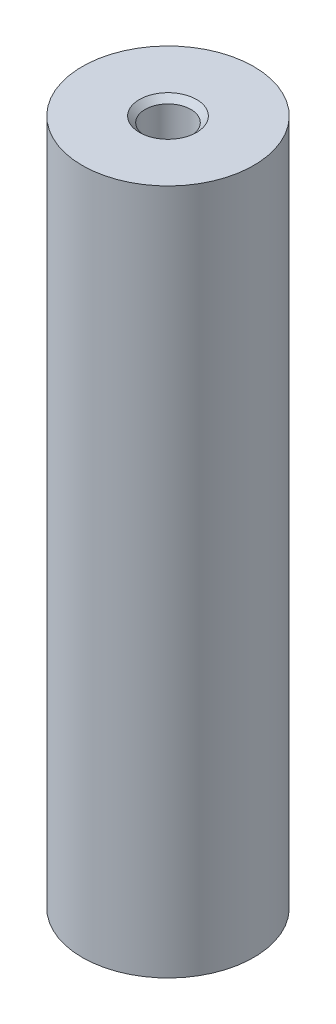
ISO-10303-21;
HEADER;
FILE_DESCRIPTION(('STEP AP214'),'2;1');
FILE_NAME('part.step','',(''),(''),'','','');
FILE_SCHEMA(('AUTOMOTIVE_DESIGN { 1 0 10303 214 1 1 1 1 }'));
ENDSEC;
DATA;
#1=APPLICATION_CONTEXT('core data for automotive mechanical design processes');
#2=APPLICATION_PROTOCOL_DEFINITION('international standard','automotive_design',2000,#1);
#3=PRODUCT_CONTEXT('',#1,'mechanical');
#4=PRODUCT('Part','Part','',(#3));
#5=PRODUCT_RELATED_PRODUCT_CATEGORY('part','',(#4));
#6=PRODUCT_DEFINITION_FORMATION('','',#4);
#7=PRODUCT_DEFINITION_CONTEXT('part definition',#1,'design');
#8=PRODUCT_DEFINITION('design','',#6,#7);
#9=PRODUCT_DEFINITION_SHAPE('','',#8);
#10=(LENGTH_UNIT() NAMED_UNIT(*) SI_UNIT(.MILLI.,.METRE.));
#11=(NAMED_UNIT(*) PLANE_ANGLE_UNIT() SI_UNIT($,.RADIAN.));
#12=(NAMED_UNIT(*) SI_UNIT($,.STERADIAN.) SOLID_ANGLE_UNIT());
#13=UNCERTAINTY_MEASURE_WITH_UNIT(LENGTH_MEASURE(1.E-05),#10,'distance_accuracy_value','');
#14=(GEOMETRIC_REPRESENTATION_CONTEXT(3) GLOBAL_UNCERTAINTY_ASSIGNED_CONTEXT((#13)) GLOBAL_UNIT_ASSIGNED_CONTEXT((#10,
#11,#12)) REPRESENTATION_CONTEXT('',''));
#15=CARTESIAN_POINT('',(0.,0.,0.));
#16=DIRECTION('',(0.,0.,1.));
#17=DIRECTION('',(1.,0.,0.));
#18=AXIS2_PLACEMENT_3D('',#15,#16,#17);
#19=CARTESIAN_POINT('',(0.,60.,0.));
#20=DIRECTION('',(0.,-1.,0.));
#21=DIRECTION('',(0.,0.,-1.));
#22=AXIS2_PLACEMENT_3D('',#19,#20,#21);
#23=CYLINDRICAL_SURFACE('',#22,7.5);
#24=CARTESIAN_POINT('',(0.,60.,0.));
#25=DIRECTION('',(0.,1.,0.));
#26=DIRECTION('',(0.,0.,1.));
#27=AXIS2_PLACEMENT_3D('',#24,#25,#26);
#28=CIRCLE('',#27,7.5);
#29=CARTESIAN_POINT('',(0.,60.,7.5));
#30=VERTEX_POINT('',#29);
#31=EDGE_CURVE('E62',#30,#30,#28,.T.);
#32=ORIENTED_EDGE('',*,*,#31,.F.);
#33=EDGE_LOOP('',(#32));
#34=FACE_BOUND('',#33,.T.);
#35=CARTESIAN_POINT('',(0.,0.,0.));
#36=DIRECTION('',(0.,1.,0.));
#37=DIRECTION('',(0.,0.,1.));
#38=AXIS2_PLACEMENT_3D('',#35,#36,#37);
#39=CIRCLE('',#38,7.5);
#40=CARTESIAN_POINT('',(0.,0.,7.5));
#41=VERTEX_POINT('',#40);
#42=EDGE_CURVE('E63',#41,#41,#39,.T.);
#43=ORIENTED_EDGE('',*,*,#42,.T.);
#44=EDGE_LOOP('',(#43));
#45=FACE_BOUND('',#44,.T.);
#46=ADVANCED_FACE('F41',(#34,#45),#23,.T.);
#47=CARTESIAN_POINT('',(0.,60.,0.));
#48=DIRECTION('',(0.,1.,0.));
#49=DIRECTION('',(0.,0.,1.));
#50=AXIS2_PLACEMENT_3D('',#47,#48,#49);
#51=PLANE('',#50);
#52=CARTESIAN_POINT('',(0.,60.,0.));
#53=DIRECTION('',(0.,1.,0.));
#54=DIRECTION('',(0.,0.,1.));
#55=AXIS2_PLACEMENT_3D('',#52,#53,#54);
#56=CIRCLE('',#55,2.5);
#57=CARTESIAN_POINT('',(0.,60.,2.5));
#58=VERTEX_POINT('',#57);
#59=EDGE_CURVE('E53',#58,#58,#56,.F.);
#60=ORIENTED_EDGE('',*,*,#59,.T.);
#61=EDGE_LOOP('',(#60));
#62=FACE_BOUND('',#61,.T.);
#63=ORIENTED_EDGE('',*,*,#31,.T.);
#64=EDGE_LOOP('',(#63));
#65=FACE_BOUND('',#64,.T.);
#66=ADVANCED_FACE('F92',(#62,#65),#51,.T.);
#67=CARTESIAN_POINT('',(0.,0.,0.));
#68=DIRECTION('',(0.,1.,0.));
#69=DIRECTION('',(0.,0.,1.));
#70=AXIS2_PLACEMENT_3D('',#67,#68,#69);
#71=PLANE('',#70);
#72=CARTESIAN_POINT('',(0.,0.,0.));
#73=DIRECTION('',(0.,1.,0.));
#74=DIRECTION('',(0.,0.,1.));
#75=AXIS2_PLACEMENT_3D('',#72,#73,#74);
#76=CIRCLE('',#75,2.5);
#77=CARTESIAN_POINT('',(0.,0.,2.5));
#78=VERTEX_POINT('',#77);
#79=EDGE_CURVE('E10',#78,#78,#76,.T.);
#80=ORIENTED_EDGE('',*,*,#79,.T.);
#81=EDGE_LOOP('',(#80));
#82=FACE_BOUND('',#81,.T.);
#83=ORIENTED_EDGE('',*,*,#42,.F.);
#84=EDGE_LOOP('',(#83));
#85=FACE_BOUND('',#84,.T.);
#86=ADVANCED_FACE('F99',(#82,#85),#71,.F.);
#87=CARTESIAN_POINT('',(0.,55.,0.));
#88=DIRECTION('',(0.,1.,0.));
#89=DIRECTION('',(0.,0.,1.));
#90=AXIS2_PLACEMENT_3D('',#87,#88,#89);
#91=CYLINDRICAL_SURFACE('',#90,2.);
#92=CARTESIAN_POINT('',(0.,59.5,0.));
#93=DIRECTION('',(0.,1.,0.));
#94=DIRECTION('',(0.,0.,1.));
#95=AXIS2_PLACEMENT_3D('',#92,#93,#94);
#96=CIRCLE('',#95,2.);
#97=CARTESIAN_POINT('',(0.,59.5,2.));
#98=VERTEX_POINT('',#97);
#99=EDGE_CURVE('E57',#98,#98,#96,.T.);
#100=ORIENTED_EDGE('',*,*,#99,.T.);
#101=EDGE_LOOP('',(#100));
#102=FACE_BOUND('',#101,.T.);
#103=CARTESIAN_POINT('',(0.,55.,0.));
#104=DIRECTION('',(0.,1.,0.));
#105=DIRECTION('',(0.,0.,1.));
#106=AXIS2_PLACEMENT_3D('',#103,#104,#105);
#107=CIRCLE('',#106,2.);
#108=CARTESIAN_POINT('',(0.,55.,2.));
#109=VERTEX_POINT('',#108);
#110=EDGE_CURVE('E66',#109,#109,#107,.T.);
#111=ORIENTED_EDGE('',*,*,#110,.F.);
#112=EDGE_LOOP('',(#111));
#113=FACE_BOUND('',#112,.T.);
#114=ADVANCED_FACE('F110',(#102,#113),#91,.F.);
#115=CARTESIAN_POINT('',(0.,55.,0.));
#116=DIRECTION('',(0.,1.,0.));
#117=DIRECTION('',(0.,0.,1.));
#118=AXIS2_PLACEMENT_3D('',#115,#116,#117);
#119=PLANE('',#118);
#120=ORIENTED_EDGE('',*,*,#110,.T.);
#121=EDGE_LOOP('',(#120));
#122=FACE_BOUND('',#121,.T.);
#123=ADVANCED_FACE('F88',(#122),#119,.T.);
#124=CARTESIAN_POINT('',(0.,59.5,0.));
#125=DIRECTION('',(0.,1.,0.));
#126=DIRECTION('',(0.,0.,1.));
#127=AXIS2_PLACEMENT_3D('',#124,#125,#126);
#128=CONICAL_SURFACE('',#127,2.,0.78539816339745);
#129=ORIENTED_EDGE('',*,*,#59,.F.);
#130=EDGE_LOOP('',(#129));
#131=FACE_BOUND('',#130,.T.);
#132=ORIENTED_EDGE('',*,*,#99,.F.);
#133=EDGE_LOOP('',(#132));
#134=FACE_BOUND('',#133,.T.);
#135=ADVANCED_FACE('F79',(#131,#134),#128,.F.);
#136=CARTESIAN_POINT('',(0.,5.,0.));
#137=DIRECTION('',(0.,-1.,0.));
#138=DIRECTION('',(0.,0.,-1.));
#139=AXIS2_PLACEMENT_3D('',#136,#137,#138);
#140=CYLINDRICAL_SURFACE('',#139,2.);
#141=CARTESIAN_POINT('',(0.,0.499999999999995,0.));
#142=DIRECTION('',(0.,1.,0.));
#143=DIRECTION('',(0.,0.,1.));
#144=AXIS2_PLACEMENT_3D('',#141,#142,#143);
#145=CIRCLE('',#144,2.);
#146=CARTESIAN_POINT('',(0.,0.499999999999995,2.));
#147=VERTEX_POINT('',#146);
#148=EDGE_CURVE('E49',#147,#147,#145,.F.);
#149=ORIENTED_EDGE('',*,*,#148,.T.);
#150=EDGE_LOOP('',(#149));
#151=FACE_BOUND('',#150,.T.);
#152=CARTESIAN_POINT('',(0.,5.,0.));
#153=DIRECTION('',(0.,-1.,0.));
#154=DIRECTION('',(0.,0.,-1.));
#155=AXIS2_PLACEMENT_3D('',#152,#153,#154);
#156=CIRCLE('',#155,2.);
#157=CARTESIAN_POINT('',(0.,5.,-2.));
#158=VERTEX_POINT('',#157);
#159=EDGE_CURVE('E71',#158,#158,#156,.T.);
#160=ORIENTED_EDGE('',*,*,#159,.F.);
#161=EDGE_LOOP('',(#160));
#162=FACE_BOUND('',#161,.T.);
#163=ADVANCED_FACE('F77',(#151,#162),#140,.F.);
#164=CARTESIAN_POINT('',(0.,5.,0.));
#165=DIRECTION('',(0.,-1.,0.));
#166=DIRECTION('',(0.,0.,-1.));
#167=AXIS2_PLACEMENT_3D('',#164,#165,#166);
#168=PLANE('',#167);
#169=ORIENTED_EDGE('',*,*,#159,.T.);
#170=EDGE_LOOP('',(#169));
#171=FACE_BOUND('',#170,.T.);
#172=ADVANCED_FACE('F75',(#171),#168,.T.);
#173=CARTESIAN_POINT('',(0.,0.499999999999995,0.));
#174=DIRECTION('',(0.,-1.,0.));
#175=DIRECTION('',(0.,0.,-1.));
#176=AXIS2_PLACEMENT_3D('',#173,#174,#175);
#177=CONICAL_SURFACE('',#176,2.,0.785398163397448);
#178=ORIENTED_EDGE('',*,*,#79,.F.);
#179=EDGE_LOOP('',(#178));
#180=FACE_BOUND('',#179,.T.);
#181=ORIENTED_EDGE('',*,*,#148,.F.);
#182=EDGE_LOOP('',(#181));
#183=FACE_BOUND('',#182,.T.);
#184=ADVANCED_FACE('F44',(#180,#183),#177,.F.);
#185=CLOSED_SHELL('',(#46,#66,#86,#114,#123,#135,#163,#172,#184));
#186=MANIFOLD_SOLID_BREP('B2',#185);
#187=ADVANCED_BREP_SHAPE_REPRESENTATION('',(#18,#186),#14);
#188=SHAPE_DEFINITION_REPRESENTATION(#9,#187);
ENDSEC;
END-ISO-10303-21;
